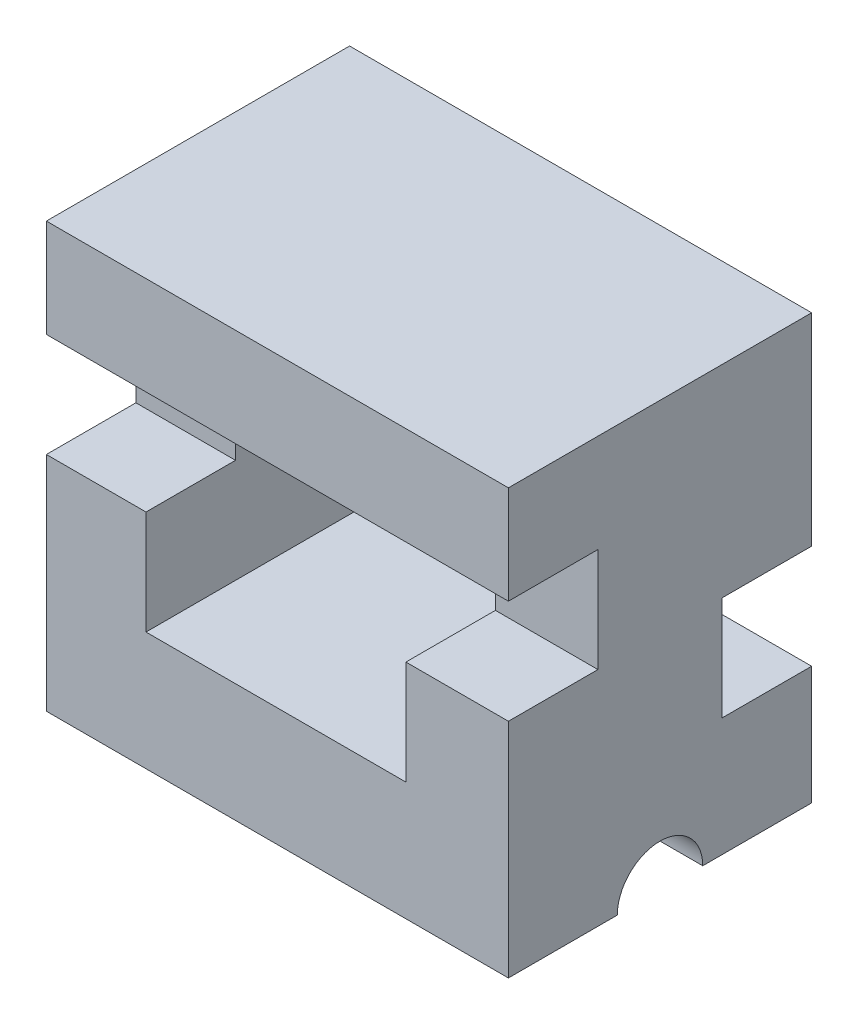
ISO-10303-21;
HEADER;
FILE_DESCRIPTION(('STEP AP214'),'2;1');
FILE_NAME('part.step','',(''),(''),'','','');
FILE_SCHEMA(('AUTOMOTIVE_DESIGN { 1 0 10303 214 1 1 1 1 }'));
ENDSEC;
DATA;
#1=APPLICATION_CONTEXT('core data for automotive mechanical design processes');
#2=APPLICATION_PROTOCOL_DEFINITION('international standard','automotive_design',2000,#1);
#3=PRODUCT_CONTEXT('',#1,'mechanical');
#4=PRODUCT('Part','Part','',(#3));
#5=PRODUCT_RELATED_PRODUCT_CATEGORY('part','',(#4));
#6=PRODUCT_DEFINITION_FORMATION('','',#4);
#7=PRODUCT_DEFINITION_CONTEXT('part definition',#1,'design');
#8=PRODUCT_DEFINITION('design','',#6,#7);
#9=PRODUCT_DEFINITION_SHAPE('','',#8);
#10=(LENGTH_UNIT() NAMED_UNIT(*) SI_UNIT(.MILLI.,.METRE.));
#11=(NAMED_UNIT(*) PLANE_ANGLE_UNIT() SI_UNIT($,.RADIAN.));
#12=(NAMED_UNIT(*) SI_UNIT($,.STERADIAN.) SOLID_ANGLE_UNIT());
#13=UNCERTAINTY_MEASURE_WITH_UNIT(LENGTH_MEASURE(1.E-05),#10,'distance_accuracy_value','');
#14=(GEOMETRIC_REPRESENTATION_CONTEXT(3) GLOBAL_UNCERTAINTY_ASSIGNED_CONTEXT((#13)) GLOBAL_UNIT_ASSIGNED_CONTEXT((#10,
#11,#12)) REPRESENTATION_CONTEXT('',''));
#15=CARTESIAN_POINT('',(0.,0.,0.));
#16=DIRECTION('',(0.,0.,1.));
#17=DIRECTION('',(1.,0.,0.));
#18=AXIS2_PLACEMENT_3D('',#15,#16,#17);
#19=CARTESIAN_POINT('',(0.,37.338,0.));
#20=DIRECTION('',(1.,0.,0.));
#21=DIRECTION('',(0.,0.,-1.));
#22=AXIS2_PLACEMENT_3D('',#19,#20,#21);
#23=PLANE('',#22);
#24=DIRECTION('',(0.,0.,-1.));
#25=VECTOR('',#24,1.);
#26=CARTESIAN_POINT('',(0.,10.414,-49.166422226509));
#27=LINE('',#26,#25);
#28=CARTESIAN_POINT('',(0.,10.414,-18.796));
#29=VERTEX_POINT('',#28);
#30=CARTESIAN_POINT('',(0.,10.414,-26.67));
#31=VERTEX_POINT('',#30);
#32=EDGE_CURVE('E212',#29,#31,#27,.T.);
#33=ORIENTED_EDGE('',*,*,#32,.T.);
#34=DIRECTION('',(0.,-1.,0.));
#35=VECTOR('',#34,1.);
#36=CARTESIAN_POINT('',(0.,37.338,-26.67));
#37=LINE('',#36,#35);
#38=CARTESIAN_POINT('',(0.,0.,-26.67));
#39=VERTEX_POINT('',#38);
#40=EDGE_CURVE('E304',#31,#39,#37,.T.);
#41=ORIENTED_EDGE('',*,*,#40,.T.);
#42=DIRECTION('',(0.,0.,1.));
#43=VECTOR('',#42,1.);
#44=CARTESIAN_POINT('',(0.,0.,0.));
#45=LINE('',#44,#43);
#46=CARTESIAN_POINT('',(0.,0.,-17.0942));
#47=VERTEX_POINT('',#46);
#48=EDGE_CURVE('E305',#39,#47,#45,.T.);
#49=ORIENTED_EDGE('',*,*,#48,.T.);
#50=CARTESIAN_POINT('',(0.,0.,-13.335));
#51=DIRECTION('',(1.,0.,0.));
#52=DIRECTION('',(0.,0.,-1.));
#53=AXIS2_PLACEMENT_3D('',#50,#51,#52);
#54=CIRCLE('',#53,3.7592);
#55=CARTESIAN_POINT('',(0.,0.,-9.57579999999998));
#56=VERTEX_POINT('',#55);
#57=EDGE_CURVE('E289',#47,#56,#54,.T.);
#58=ORIENTED_EDGE('',*,*,#57,.T.);
#59=CARTESIAN_POINT('',(0.,0.,0.));
#60=VERTEX_POINT('',#59);
#61=EDGE_CURVE('E292',#56,#60,#45,.T.);
#62=ORIENTED_EDGE('',*,*,#61,.T.);
#63=DIRECTION('',(0.,-1.,0.));
#64=VECTOR('',#63,1.);
#65=CARTESIAN_POINT('',(0.,37.338,0.));
#66=LINE('',#65,#64);
#67=CARTESIAN_POINT('',(0.,19.558,0.));
#68=VERTEX_POINT('',#67);
#69=EDGE_CURVE('E327',#68,#60,#66,.T.);
#70=ORIENTED_EDGE('',*,*,#69,.F.);
#71=DIRECTION('',(0.,0.,1.));
#72=VECTOR('',#71,1.);
#73=CARTESIAN_POINT('',(0.,19.558,-49.166422226509));
#74=LINE('',#73,#72);
#75=CARTESIAN_POINT('',(0.,19.558,-7.87400000000002));
#76=VERTEX_POINT('',#75);
#77=EDGE_CURVE('E229',#76,#68,#74,.T.);
#78=ORIENTED_EDGE('',*,*,#77,.F.);
#79=DIRECTION('',(0.,1.,0.));
#80=VECTOR('',#79,1.);
#81=CARTESIAN_POINT('',(0.,18.669,-7.874));
#82=LINE('',#81,#80);
#83=CARTESIAN_POINT('',(0.,28.702,-7.87400000000002));
#84=VERTEX_POINT('',#83);
#85=EDGE_CURVE('E231',#76,#84,#82,.T.);
#86=ORIENTED_EDGE('',*,*,#85,.T.);
#87=DIRECTION('',(0.,0.,-1.));
#88=VECTOR('',#87,1.);
#89=CARTESIAN_POINT('',(0.,28.702,-49.166422226509));
#90=LINE('',#89,#88);
#91=CARTESIAN_POINT('',(0.,28.702,0.));
#92=VERTEX_POINT('',#91);
#93=EDGE_CURVE('E235',#92,#84,#90,.T.);
#94=ORIENTED_EDGE('',*,*,#93,.F.);
#95=CARTESIAN_POINT('',(0.,37.338,0.));
#96=VERTEX_POINT('',#95);
#97=EDGE_CURVE('E328',#96,#92,#66,.T.);
#98=ORIENTED_EDGE('',*,*,#97,.F.);
#99=DIRECTION('',(0.,0.,1.));
#100=VECTOR('',#99,1.);
#101=CARTESIAN_POINT('',(0.,37.338,0.));
#102=LINE('',#101,#100);
#103=CARTESIAN_POINT('',(0.,37.338,-26.67));
#104=VERTEX_POINT('',#103);
#105=EDGE_CURVE('E294',#104,#96,#102,.T.);
#106=ORIENTED_EDGE('',*,*,#105,.F.);
#107=CARTESIAN_POINT('',(0.,19.558,-26.67));
#108=VERTEX_POINT('',#107);
#109=EDGE_CURVE('E317',#104,#108,#37,.T.);
#110=ORIENTED_EDGE('',*,*,#109,.T.);
#111=DIRECTION('',(0.,0.,-1.));
#112=VECTOR('',#111,1.);
#113=CARTESIAN_POINT('',(0.,19.558,-49.166422226509));
#114=LINE('',#113,#112);
#115=CARTESIAN_POINT('',(0.,19.558,-18.796));
#116=VERTEX_POINT('',#115);
#117=EDGE_CURVE('E46',#116,#108,#114,.T.);
#118=ORIENTED_EDGE('',*,*,#117,.F.);
#119=DIRECTION('',(0.,-1.,0.));
#120=VECTOR('',#119,1.);
#121=CARTESIAN_POINT('',(0.,18.669,-18.796));
#122=LINE('',#121,#120);
#123=EDGE_CURVE('E222',#116,#29,#122,.T.);
#124=ORIENTED_EDGE('',*,*,#123,.T.);
#125=EDGE_LOOP('',(#33,#41,#49,#58,#62,#70,#78,#86,#94,#98,#106,#110,#118,#124));
#126=FACE_BOUND('',#125,.T.);
#127=ADVANCED_FACE('F32',(#126),#23,.F.);
#128=CARTESIAN_POINT('',(40.64,37.338,0.));
#129=DIRECTION('',(-1.,0.,0.));
#130=DIRECTION('',(0.,0.,1.));
#131=AXIS2_PLACEMENT_3D('',#128,#129,#130);
#132=PLANE('',#131);
#133=DIRECTION('',(0.,0.,1.));
#134=VECTOR('',#133,1.);
#135=CARTESIAN_POINT('',(40.64,10.414,-49.1664222265091));
#136=LINE('',#135,#134);
#137=CARTESIAN_POINT('',(40.64,10.414,-26.67));
#138=VERTEX_POINT('',#137);
#139=CARTESIAN_POINT('',(40.64,10.414,-18.796));
#140=VERTEX_POINT('',#139);
#141=EDGE_CURVE('E185',#138,#140,#136,.T.);
#142=ORIENTED_EDGE('',*,*,#141,.T.);
#143=DIRECTION('',(0.,1.,0.));
#144=VECTOR('',#143,1.);
#145=CARTESIAN_POINT('',(40.64,18.669,-18.796));
#146=LINE('',#145,#144);
#147=CARTESIAN_POINT('',(40.64,19.558,-18.796));
#148=VERTEX_POINT('',#147);
#149=EDGE_CURVE('E195',#140,#148,#146,.T.);
#150=ORIENTED_EDGE('',*,*,#149,.T.);
#151=DIRECTION('',(0.,0.,1.));
#152=VECTOR('',#151,1.);
#153=CARTESIAN_POINT('',(40.64,19.558,-49.1664222265091));
#154=LINE('',#153,#152);
#155=CARTESIAN_POINT('',(40.64,19.558,-26.67));
#156=VERTEX_POINT('',#155);
#157=EDGE_CURVE('E192',#156,#148,#154,.T.);
#158=ORIENTED_EDGE('',*,*,#157,.F.);
#159=DIRECTION('',(0.,-1.,0.));
#160=VECTOR('',#159,1.);
#161=CARTESIAN_POINT('',(40.64,37.338,-26.67));
#162=LINE('',#161,#160);
#163=CARTESIAN_POINT('',(40.64,37.338,-26.67));
#164=VERTEX_POINT('',#163);
#165=EDGE_CURVE('E320',#164,#156,#162,.T.);
#166=ORIENTED_EDGE('',*,*,#165,.F.);
#167=DIRECTION('',(0.,0.,-1.));
#168=VECTOR('',#167,1.);
#169=CARTESIAN_POINT('',(40.64,37.338,0.));
#170=LINE('',#169,#168);
#171=CARTESIAN_POINT('',(40.64,37.338,0.));
#172=VERTEX_POINT('',#171);
#173=EDGE_CURVE('E300',#172,#164,#170,.T.);
#174=ORIENTED_EDGE('',*,*,#173,.F.);
#175=DIRECTION('',(0.,-1.,0.));
#176=VECTOR('',#175,1.);
#177=CARTESIAN_POINT('',(40.64,37.338,0.));
#178=LINE('',#177,#176);
#179=CARTESIAN_POINT('',(40.64,28.702,0.));
#180=VERTEX_POINT('',#179);
#181=EDGE_CURVE('E324',#172,#180,#178,.T.);
#182=ORIENTED_EDGE('',*,*,#181,.T.);
#183=DIRECTION('',(0.,0.,1.));
#184=VECTOR('',#183,1.);
#185=CARTESIAN_POINT('',(40.64,28.702,-49.1664222265091));
#186=LINE('',#185,#184);
#187=CARTESIAN_POINT('',(40.64,28.702,-7.87400000000002));
#188=VERTEX_POINT('',#187);
#189=EDGE_CURVE('E238',#188,#180,#186,.T.);
#190=ORIENTED_EDGE('',*,*,#189,.F.);
#191=DIRECTION('',(0.,-1.,0.));
#192=VECTOR('',#191,1.);
#193=CARTESIAN_POINT('',(40.64,18.669,-7.87400000000002));
#194=LINE('',#193,#192);
#195=CARTESIAN_POINT('',(40.64,19.558,-7.87400000000002));
#196=VERTEX_POINT('',#195);
#197=EDGE_CURVE('E228',#188,#196,#194,.T.);
#198=ORIENTED_EDGE('',*,*,#197,.T.);
#199=DIRECTION('',(0.,0.,-1.));
#200=VECTOR('',#199,1.);
#201=CARTESIAN_POINT('',(40.64,19.558,-49.1664222265091));
#202=LINE('',#201,#200);
#203=CARTESIAN_POINT('',(40.64,19.558,0.));
#204=VERTEX_POINT('',#203);
#205=EDGE_CURVE('E241',#204,#196,#202,.T.);
#206=ORIENTED_EDGE('',*,*,#205,.F.);
#207=CARTESIAN_POINT('',(40.64,0.,0.));
#208=VERTEX_POINT('',#207);
#209=EDGE_CURVE('E323',#204,#208,#178,.T.);
#210=ORIENTED_EDGE('',*,*,#209,.T.);
#211=DIRECTION('',(0.,0.,-1.));
#212=VECTOR('',#211,1.);
#213=CARTESIAN_POINT('',(40.64,0.,0.));
#214=LINE('',#213,#212);
#215=CARTESIAN_POINT('',(40.64,0.,-9.5758));
#216=VERTEX_POINT('',#215);
#217=EDGE_CURVE('E312',#208,#216,#214,.T.);
#218=ORIENTED_EDGE('',*,*,#217,.T.);
#219=CARTESIAN_POINT('',(40.64,0.,-13.335));
#220=DIRECTION('',(1.,0.,0.));
#221=DIRECTION('',(0.,0.,-1.));
#222=AXIS2_PLACEMENT_3D('',#219,#220,#221);
#223=CIRCLE('',#222,3.7592);
#224=CARTESIAN_POINT('',(40.64,0.,-17.0942));
#225=VERTEX_POINT('',#224);
#226=EDGE_CURVE('E288',#225,#216,#223,.T.);
#227=ORIENTED_EDGE('',*,*,#226,.F.);
#228=CARTESIAN_POINT('',(40.64,0.,-26.67));
#229=VERTEX_POINT('',#228);
#230=EDGE_CURVE('E311',#225,#229,#214,.T.);
#231=ORIENTED_EDGE('',*,*,#230,.T.);
#232=EDGE_CURVE('E204',#138,#229,#162,.T.);
#233=ORIENTED_EDGE('',*,*,#232,.F.);
#234=EDGE_LOOP('',(#142,#150,#158,#166,#174,#182,#190,#198,#206,#210,#218,#227,#231,#233));
#235=FACE_BOUND('',#234,.T.);
#236=ADVANCED_FACE('F202',(#235),#132,.F.);
#237=CARTESIAN_POINT('',(0.,37.338,-26.67));
#238=DIRECTION('',(0.,0.,1.));
#239=DIRECTION('',(1.,0.,0.));
#240=AXIS2_PLACEMENT_3D('',#237,#238,#239);
#241=PLANE('',#240);
#242=DIRECTION('',(-1.,0.,0.));
#243=VECTOR('',#242,1.);
#244=CARTESIAN_POINT('',(8.76299999999999,10.414,-26.67));
#245=LINE('',#244,#243);
#246=EDGE_CURVE('E269',#138,#31,#245,.T.);
#247=ORIENTED_EDGE('',*,*,#246,.F.);
#248=ORIENTED_EDGE('',*,*,#232,.T.);
#249=DIRECTION('',(-1.,0.,0.));
#250=VECTOR('',#249,1.);
#251=CARTESIAN_POINT('',(0.,0.,-26.67));
#252=LINE('',#251,#250);
#253=EDGE_CURVE('E298',#229,#39,#252,.T.);
#254=ORIENTED_EDGE('',*,*,#253,.T.);
#255=ORIENTED_EDGE('',*,*,#40,.F.);
#256=EDGE_LOOP('',(#247,#248,#254,#255));
#257=FACE_BOUND('',#256,.T.);
#258=ADVANCED_FACE('F401',(#257),#241,.F.);
#259=CARTESIAN_POINT('',(0.,37.338,0.));
#260=DIRECTION('',(0.,0.,-1.));
#261=DIRECTION('',(-1.,0.,0.));
#262=AXIS2_PLACEMENT_3D('',#259,#260,#261);
#263=PLANE('',#262);
#264=ORIENTED_EDGE('',*,*,#209,.F.);
#265=DIRECTION('',(1.,0.,0.));
#266=VECTOR('',#265,1.);
#267=CARTESIAN_POINT('',(-12.0670050965432,19.558,0.));
#268=LINE('',#267,#266);
#269=CARTESIAN_POINT('',(31.623,19.558,0.));
#270=VERTEX_POINT('',#269);
#271=EDGE_CURVE('E250',#270,#204,#268,.T.);
#272=ORIENTED_EDGE('',*,*,#271,.F.);
#273=DIRECTION('',(0.,1.,0.));
#274=VECTOR('',#273,1.);
#275=CARTESIAN_POINT('',(31.623,28.702,0.));
#276=LINE('',#275,#274);
#277=CARTESIAN_POINT('',(31.623,10.414,0.));
#278=VERTEX_POINT('',#277);
#279=EDGE_CURVE('E274',#278,#270,#276,.T.);
#280=ORIENTED_EDGE('',*,*,#279,.F.);
#281=DIRECTION('',(1.,0.,0.));
#282=VECTOR('',#281,1.);
#283=CARTESIAN_POINT('',(8.76299999999999,10.414,0.));
#284=LINE('',#283,#282);
#285=CARTESIAN_POINT('',(8.76299999999999,10.414,0.));
#286=VERTEX_POINT('',#285);
#287=EDGE_CURVE('E272',#286,#278,#284,.T.);
#288=ORIENTED_EDGE('',*,*,#287,.F.);
#289=DIRECTION('',(0.,-1.,0.));
#290=VECTOR('',#289,1.);
#291=CARTESIAN_POINT('',(8.76299999999999,28.702,0.));
#292=LINE('',#291,#290);
#293=CARTESIAN_POINT('',(8.76299999999999,19.558,0.));
#294=VERTEX_POINT('',#293);
#295=EDGE_CURVE('E260',#294,#286,#292,.T.);
#296=ORIENTED_EDGE('',*,*,#295,.F.);
#297=EDGE_CURVE('E248',#68,#294,#268,.T.);
#298=ORIENTED_EDGE('',*,*,#297,.F.);
#299=ORIENTED_EDGE('',*,*,#69,.T.);
#300=DIRECTION('',(1.,0.,0.));
#301=VECTOR('',#300,1.);
#302=CARTESIAN_POINT('',(0.,0.,0.));
#303=LINE('',#302,#301);
#304=EDGE_CURVE('E308',#60,#208,#303,.T.);
#305=ORIENTED_EDGE('',*,*,#304,.T.);
#306=EDGE_LOOP('',(#264,#272,#280,#288,#296,#298,#299,#305));
#307=FACE_BOUND('',#306,.T.);
#308=ADVANCED_FACE('F347',(#307),#263,.F.);
#309=CARTESIAN_POINT('',(8.76299999999999,28.702,-55.945084013543));
#310=DIRECTION('',(-1.,0.,0.));
#311=DIRECTION('',(0.,-1.,0.));
#312=AXIS2_PLACEMENT_3D('',#309,#310,#311);
#313=PLANE('',#312);
#314=DIRECTION('',(0.,-1.,0.));
#315=VECTOR('',#314,1.);
#316=CARTESIAN_POINT('',(8.76299999999999,28.702,-18.796));
#317=LINE('',#316,#315);
#318=CARTESIAN_POINT('',(8.76299999999999,19.558,-18.796));
#319=VERTEX_POINT('',#318);
#320=CARTESIAN_POINT('',(8.76299999999999,10.414,-18.796));
#321=VERTEX_POINT('',#320);
#322=EDGE_CURVE('E221',#319,#321,#317,.T.);
#323=ORIENTED_EDGE('',*,*,#322,.F.);
#324=DIRECTION('',(0.,0.,-1.));
#325=VECTOR('',#324,1.);
#326=CARTESIAN_POINT('',(8.76299999999999,19.558,-55.945084013543));
#327=LINE('',#326,#325);
#328=CARTESIAN_POINT('',(8.76299999999999,19.558,-26.67));
#329=VERTEX_POINT('',#328);
#330=EDGE_CURVE('E225',#319,#329,#327,.T.);
#331=ORIENTED_EDGE('',*,*,#330,.T.);
#332=DIRECTION('',(0.,1.,0.));
#333=VECTOR('',#332,1.);
#334=CARTESIAN_POINT('',(8.76299999999999,28.702,-26.67));
#335=LINE('',#334,#333);
#336=CARTESIAN_POINT('',(8.76299999999999,28.702,-26.67));
#337=VERTEX_POINT('',#336);
#338=EDGE_CURVE('E267',#329,#337,#335,.T.);
#339=ORIENTED_EDGE('',*,*,#338,.T.);
#340=DIRECTION('',(0.,0.,1.));
#341=VECTOR('',#340,1.);
#342=CARTESIAN_POINT('',(8.76299999999999,28.702,-55.945084013543));
#343=LINE('',#342,#341);
#344=CARTESIAN_POINT('',(8.76299999999999,28.702,-7.87400000000001));
#345=VERTEX_POINT('',#344);
#346=EDGE_CURVE('E265',#337,#345,#343,.T.);
#347=ORIENTED_EDGE('',*,*,#346,.T.);
#348=DIRECTION('',(0.,1.,0.));
#349=VECTOR('',#348,1.);
#350=CARTESIAN_POINT('',(8.76299999999999,28.702,-7.874));
#351=LINE('',#350,#349);
#352=CARTESIAN_POINT('',(8.76299999999999,19.558,-7.874));
#353=VERTEX_POINT('',#352);
#354=EDGE_CURVE('E257',#353,#345,#351,.T.);
#355=ORIENTED_EDGE('',*,*,#354,.F.);
#356=DIRECTION('',(0.,0.,1.));
#357=VECTOR('',#356,1.);
#358=CARTESIAN_POINT('',(8.76299999999999,19.558,-55.945084013543));
#359=LINE('',#358,#357);
#360=EDGE_CURVE('E254',#353,#294,#359,.T.);
#361=ORIENTED_EDGE('',*,*,#360,.T.);
#362=ORIENTED_EDGE('',*,*,#295,.T.);
#363=DIRECTION('',(0.,0.,1.));
#364=VECTOR('',#363,1.);
#365=CARTESIAN_POINT('',(8.76299999999999,10.414,-55.945084013543));
#366=LINE('',#365,#364);
#367=EDGE_CURVE('E279',#321,#286,#366,.T.);
#368=ORIENTED_EDGE('',*,*,#367,.F.);
#369=EDGE_LOOP('',(#323,#331,#339,#347,#355,#361,#362,#368));
#370=FACE_BOUND('',#369,.T.);
#371=ADVANCED_FACE('F391',(#370),#313,.F.);
#372=CARTESIAN_POINT('',(31.623,28.702,-55.945084013543));
#373=DIRECTION('',(1.,0.,0.));
#374=DIRECTION('',(0.,1.,0.));
#375=AXIS2_PLACEMENT_3D('',#372,#373,#374);
#376=PLANE('',#375);
#377=DIRECTION('',(0.,-1.,0.));
#378=VECTOR('',#377,1.);
#379=CARTESIAN_POINT('',(31.623,28.702,-26.67));
#380=LINE('',#379,#378);
#381=CARTESIAN_POINT('',(31.623,28.702,-26.67));
#382=VERTEX_POINT('',#381);
#383=CARTESIAN_POINT('',(31.623,19.558,-26.67));
#384=VERTEX_POINT('',#383);
#385=EDGE_CURVE('E261',#382,#384,#380,.T.);
#386=ORIENTED_EDGE('',*,*,#385,.T.);
#387=DIRECTION('',(0.,0.,1.));
#388=VECTOR('',#387,1.);
#389=CARTESIAN_POINT('',(31.623,19.558,-55.945084013543));
#390=LINE('',#389,#388);
#391=CARTESIAN_POINT('',(31.623,19.558,-18.796));
#392=VERTEX_POINT('',#391);
#393=EDGE_CURVE('E54',#384,#392,#390,.T.);
#394=ORIENTED_EDGE('',*,*,#393,.T.);
#395=DIRECTION('',(0.,1.,0.));
#396=VECTOR('',#395,1.);
#397=CARTESIAN_POINT('',(31.623,28.702,-18.796));
#398=LINE('',#397,#396);
#399=CARTESIAN_POINT('',(31.623,10.414,-18.796));
#400=VERTEX_POINT('',#399);
#401=EDGE_CURVE('E219',#400,#392,#398,.T.);
#402=ORIENTED_EDGE('',*,*,#401,.F.);
#403=DIRECTION('',(0.,0.,1.));
#404=VECTOR('',#403,1.);
#405=CARTESIAN_POINT('',(31.623,10.414,-55.945084013543));
#406=LINE('',#405,#404);
#407=EDGE_CURVE('E188',#400,#278,#406,.T.);
#408=ORIENTED_EDGE('',*,*,#407,.T.);
#409=ORIENTED_EDGE('',*,*,#279,.T.);
#410=DIRECTION('',(0.,0.,-1.));
#411=VECTOR('',#410,1.);
#412=CARTESIAN_POINT('',(31.623,19.558,-55.945084013543));
#413=LINE('',#412,#411);
#414=CARTESIAN_POINT('',(31.623,19.558,-7.87400000000001));
#415=VERTEX_POINT('',#414);
#416=EDGE_CURVE('E39',#270,#415,#413,.T.);
#417=ORIENTED_EDGE('',*,*,#416,.T.);
#418=DIRECTION('',(0.,-1.,0.));
#419=VECTOR('',#418,1.);
#420=CARTESIAN_POINT('',(31.623,28.702,-7.87400000000001));
#421=LINE('',#420,#419);
#422=CARTESIAN_POINT('',(31.623,28.702,-7.87400000000001));
#423=VERTEX_POINT('',#422);
#424=EDGE_CURVE('E11',#423,#415,#421,.T.);
#425=ORIENTED_EDGE('',*,*,#424,.F.);
#426=DIRECTION('',(0.,0.,1.));
#427=VECTOR('',#426,1.);
#428=CARTESIAN_POINT('',(31.623,28.702,-55.945084013543));
#429=LINE('',#428,#427);
#430=EDGE_CURVE('E282',#382,#423,#429,.T.);
#431=ORIENTED_EDGE('',*,*,#430,.F.);
#432=EDGE_LOOP('',(#386,#394,#402,#408,#409,#417,#425,#431));
#433=FACE_BOUND('',#432,.T.);
#434=ADVANCED_FACE('F337',(#433),#376,.F.);
#435=CARTESIAN_POINT('',(0.,0.,-26.67));
#436=DIRECTION('',(0.,-1.,0.));
#437=DIRECTION('',(0.,0.,-1.));
#438=AXIS2_PLACEMENT_3D('',#435,#436,#437);
#439=PLANE('',#438);
#440=DIRECTION('',(1.,0.,0.));
#441=VECTOR('',#440,1.);
#442=CARTESIAN_POINT('',(0.,0.,-17.0942));
#443=LINE('',#442,#441);
#444=EDGE_CURVE('E333',#47,#225,#443,.T.);
#445=ORIENTED_EDGE('',*,*,#444,.F.);
#446=ORIENTED_EDGE('',*,*,#48,.F.);
#447=ORIENTED_EDGE('',*,*,#253,.F.);
#448=ORIENTED_EDGE('',*,*,#230,.F.);
#449=EDGE_LOOP('',(#445,#446,#447,#448));
#450=FACE_BOUND('',#449,.T.);
#451=ADVANCED_FACE('F407',(#450),#439,.T.);
#452=ORIENTED_EDGE('',*,*,#97,.T.);
#453=DIRECTION('',(-1.,0.,0.));
#454=VECTOR('',#453,1.);
#455=CARTESIAN_POINT('',(8.76299999999999,28.702,0.));
#456=LINE('',#455,#454);
#457=EDGE_CURVE('E277',#180,#92,#456,.T.);
#458=ORIENTED_EDGE('',*,*,#457,.F.);
#459=ORIENTED_EDGE('',*,*,#181,.F.);
#460=DIRECTION('',(1.,0.,0.));
#461=VECTOR('',#460,1.);
#462=CARTESIAN_POINT('',(0.,37.338,0.));
#463=LINE('',#462,#461);
#464=EDGE_CURVE('E297',#96,#172,#463,.T.);
#465=ORIENTED_EDGE('',*,*,#464,.F.);
#466=EDGE_LOOP('',(#452,#458,#459,#465));
#467=FACE_BOUND('',#466,.T.);
#468=ADVANCED_FACE('F375',(#467),#263,.F.);
#469=ORIENTED_EDGE('',*,*,#165,.T.);
#470=DIRECTION('',(1.,0.,0.));
#471=VECTOR('',#470,1.);
#472=CARTESIAN_POINT('',(-12.0670050965433,19.558,-26.67));
#473=LINE('',#472,#471);
#474=EDGE_CURVE('E214',#384,#156,#473,.T.);
#475=ORIENTED_EDGE('',*,*,#474,.F.);
#476=ORIENTED_EDGE('',*,*,#385,.F.);
#477=DIRECTION('',(1.,0.,0.));
#478=VECTOR('',#477,1.);
#479=CARTESIAN_POINT('',(8.76299999999999,28.702,-26.67));
#480=LINE('',#479,#478);
#481=EDGE_CURVE('E264',#337,#382,#480,.T.);
#482=ORIENTED_EDGE('',*,*,#481,.F.);
#483=ORIENTED_EDGE('',*,*,#338,.F.);
#484=EDGE_CURVE('E213',#108,#329,#473,.T.);
#485=ORIENTED_EDGE('',*,*,#484,.F.);
#486=ORIENTED_EDGE('',*,*,#109,.F.);
#487=DIRECTION('',(-1.,0.,0.));
#488=VECTOR('',#487,1.);
#489=CARTESIAN_POINT('',(0.,37.338,-26.67));
#490=LINE('',#489,#488);
#491=EDGE_CURVE('E302',#164,#104,#490,.T.);
#492=ORIENTED_EDGE('',*,*,#491,.F.);
#493=EDGE_LOOP('',(#469,#475,#476,#482,#483,#485,#486,#492));
#494=FACE_BOUND('',#493,.T.);
#495=ADVANCED_FACE('F362',(#494),#241,.F.);
#496=CARTESIAN_POINT('',(0.,37.338,-26.67));
#497=DIRECTION('',(0.,-1.,0.));
#498=DIRECTION('',(0.,0.,-1.));
#499=AXIS2_PLACEMENT_3D('',#496,#497,#498);
#500=PLANE('',#499);
#501=ORIENTED_EDGE('',*,*,#105,.T.);
#502=ORIENTED_EDGE('',*,*,#464,.T.);
#503=ORIENTED_EDGE('',*,*,#173,.T.);
#504=ORIENTED_EDGE('',*,*,#491,.T.);
#505=EDGE_LOOP('',(#501,#502,#503,#504));
#506=FACE_BOUND('',#505,.T.);
#507=ADVANCED_FACE('F371',(#506),#500,.F.);
#508=DIRECTION('',(1.,0.,0.));
#509=VECTOR('',#508,1.);
#510=CARTESIAN_POINT('',(0.,0.,-9.57579999999998));
#511=LINE('',#510,#509);
#512=EDGE_CURVE('E331',#216,#56,#511,.F.);
#513=ORIENTED_EDGE('',*,*,#512,.F.);
#514=ORIENTED_EDGE('',*,*,#217,.F.);
#515=ORIENTED_EDGE('',*,*,#304,.F.);
#516=ORIENTED_EDGE('',*,*,#61,.F.);
#517=EDGE_LOOP('',(#513,#514,#515,#516));
#518=FACE_BOUND('',#517,.T.);
#519=ADVANCED_FACE('F413',(#518),#439,.T.);
#520=CARTESIAN_POINT('',(0.,0.,-13.335));
#521=DIRECTION('',(1.,0.,0.));
#522=DIRECTION('',(0.,0.,-1.));
#523=AXIS2_PLACEMENT_3D('',#520,#521,#522);
#524=CYLINDRICAL_SURFACE('',#523,3.7592);
#525=ORIENTED_EDGE('',*,*,#444,.T.);
#526=ORIENTED_EDGE('',*,*,#226,.T.);
#527=ORIENTED_EDGE('',*,*,#512,.T.);
#528=ORIENTED_EDGE('',*,*,#57,.F.);
#529=EDGE_LOOP('',(#525,#526,#527,#528));
#530=FACE_BOUND('',#529,.T.);
#531=ADVANCED_FACE('F414',(#530),#524,.F.);
#532=CARTESIAN_POINT('',(8.76299999999999,28.702,-55.945084013543));
#533=DIRECTION('',(0.,1.,0.));
#534=DIRECTION('',(0.,0.,1.));
#535=AXIS2_PLACEMENT_3D('',#532,#533,#534);
#536=PLANE('',#535);
#537=ORIENTED_EDGE('',*,*,#457,.T.);
#538=ORIENTED_EDGE('',*,*,#93,.T.);
#539=DIRECTION('',(1.,0.,0.));
#540=VECTOR('',#539,1.);
#541=CARTESIAN_POINT('',(-12.0670050965432,28.702,-7.87399999999999));
#542=LINE('',#541,#540);
#543=EDGE_CURVE('E251',#84,#345,#542,.T.);
#544=ORIENTED_EDGE('',*,*,#543,.T.);
#545=ORIENTED_EDGE('',*,*,#346,.F.);
#546=ORIENTED_EDGE('',*,*,#481,.T.);
#547=ORIENTED_EDGE('',*,*,#430,.T.);
#548=EDGE_CURVE('E244',#423,#188,#542,.T.);
#549=ORIENTED_EDGE('',*,*,#548,.T.);
#550=ORIENTED_EDGE('',*,*,#189,.T.);
#551=EDGE_LOOP('',(#537,#538,#544,#545,#546,#547,#549,#550));
#552=FACE_BOUND('',#551,.T.);
#553=ADVANCED_FACE('F357',(#552),#536,.F.);
#554=CARTESIAN_POINT('',(8.76299999999999,10.414,-55.945084013543));
#555=DIRECTION('',(0.,-1.,0.));
#556=DIRECTION('',(0.,0.,-1.));
#557=AXIS2_PLACEMENT_3D('',#554,#555,#556);
#558=PLANE('',#557);
#559=ORIENTED_EDGE('',*,*,#246,.T.);
#560=ORIENTED_EDGE('',*,*,#32,.F.);
#561=DIRECTION('',(1.,0.,0.));
#562=VECTOR('',#561,1.);
#563=CARTESIAN_POINT('',(-12.0670050965432,10.414,-18.796));
#564=LINE('',#563,#562);
#565=EDGE_CURVE('E191',#29,#321,#564,.T.);
#566=ORIENTED_EDGE('',*,*,#565,.T.);
#567=ORIENTED_EDGE('',*,*,#367,.T.);
#568=ORIENTED_EDGE('',*,*,#287,.T.);
#569=ORIENTED_EDGE('',*,*,#407,.F.);
#570=EDGE_CURVE('E181',#400,#140,#564,.T.);
#571=ORIENTED_EDGE('',*,*,#570,.T.);
#572=ORIENTED_EDGE('',*,*,#141,.F.);
#573=EDGE_LOOP('',(#559,#560,#566,#567,#568,#569,#571,#572));
#574=FACE_BOUND('',#573,.T.);
#575=ADVANCED_FACE('F183',(#574),#558,.F.);
#576=CARTESIAN_POINT('',(-12.0670050965433,19.558,-49.166422226509));
#577=DIRECTION('',(0.,-1.,0.));
#578=DIRECTION('',(0.,0.,-1.));
#579=AXIS2_PLACEMENT_3D('',#576,#577,#578);
#580=PLANE('',#579);
#581=ORIENTED_EDGE('',*,*,#271,.T.);
#582=ORIENTED_EDGE('',*,*,#205,.T.);
#583=DIRECTION('',(1.,0.,0.));
#584=VECTOR('',#583,1.);
#585=CARTESIAN_POINT('',(-12.0670050965432,19.558,-7.87399999999999));
#586=LINE('',#585,#584);
#587=EDGE_CURVE('E247',#415,#196,#586,.T.);
#588=ORIENTED_EDGE('',*,*,#587,.F.);
#589=ORIENTED_EDGE('',*,*,#416,.F.);
#590=EDGE_LOOP('',(#581,#582,#588,#589));
#591=FACE_BOUND('',#590,.T.);
#592=ADVANCED_FACE('F343',(#591),#580,.F.);
#593=CARTESIAN_POINT('',(-12.0670050965432,18.669,-7.87399999999999));
#594=DIRECTION('',(0.,0.,1.));
#595=DIRECTION('',(1.,0.,0.));
#596=AXIS2_PLACEMENT_3D('',#593,#594,#595);
#597=PLANE('',#596);
#598=ORIENTED_EDGE('',*,*,#424,.T.);
#599=ORIENTED_EDGE('',*,*,#587,.T.);
#600=ORIENTED_EDGE('',*,*,#197,.F.);
#601=ORIENTED_EDGE('',*,*,#548,.F.);
#602=EDGE_LOOP('',(#598,#599,#600,#601));
#603=FACE_BOUND('',#602,.T.);
#604=ADVANCED_FACE('F355',(#603),#597,.T.);
#605=ORIENTED_EDGE('',*,*,#354,.T.);
#606=ORIENTED_EDGE('',*,*,#543,.F.);
#607=ORIENTED_EDGE('',*,*,#85,.F.);
#608=EDGE_CURVE('E232',#76,#353,#586,.T.);
#609=ORIENTED_EDGE('',*,*,#608,.T.);
#610=EDGE_LOOP('',(#605,#606,#607,#609));
#611=FACE_BOUND('',#610,.T.);
#612=ADVANCED_FACE('F383',(#611),#597,.T.);
#613=ORIENTED_EDGE('',*,*,#608,.F.);
#614=ORIENTED_EDGE('',*,*,#77,.T.);
#615=ORIENTED_EDGE('',*,*,#297,.T.);
#616=ORIENTED_EDGE('',*,*,#360,.F.);
#617=EDGE_LOOP('',(#613,#614,#615,#616));
#618=FACE_BOUND('',#617,.T.);
#619=ADVANCED_FACE('F386',(#618),#580,.F.);
#620=CARTESIAN_POINT('',(-12.0670050965433,19.558,-49.166422226509));
#621=DIRECTION('',(0.,1.,0.));
#622=DIRECTION('',(0.,0.,1.));
#623=AXIS2_PLACEMENT_3D('',#620,#621,#622);
#624=PLANE('',#623);
#625=DIRECTION('',(1.,0.,0.));
#626=VECTOR('',#625,1.);
#627=CARTESIAN_POINT('',(-12.0670050965432,19.558,-18.796));
#628=LINE('',#627,#626);
#629=EDGE_CURVE('E209',#116,#319,#628,.T.);
#630=ORIENTED_EDGE('',*,*,#629,.F.);
#631=ORIENTED_EDGE('',*,*,#117,.T.);
#632=ORIENTED_EDGE('',*,*,#484,.T.);
#633=ORIENTED_EDGE('',*,*,#330,.F.);
#634=EDGE_LOOP('',(#630,#631,#632,#633));
#635=FACE_BOUND('',#634,.T.);
#636=ADVANCED_FACE('F397',(#635),#624,.F.);
#637=CARTESIAN_POINT('',(-12.0670050965432,18.669,-18.796));
#638=DIRECTION('',(0.,0.,-1.));
#639=DIRECTION('',(-1.,0.,0.));
#640=AXIS2_PLACEMENT_3D('',#637,#638,#639);
#641=PLANE('',#640);
#642=ORIENTED_EDGE('',*,*,#322,.T.);
#643=ORIENTED_EDGE('',*,*,#565,.F.);
#644=ORIENTED_EDGE('',*,*,#123,.F.);
#645=ORIENTED_EDGE('',*,*,#629,.T.);
#646=EDGE_LOOP('',(#642,#643,#644,#645));
#647=FACE_BOUND('',#646,.T.);
#648=ADVANCED_FACE('F395',(#647),#641,.T.);
#649=ORIENTED_EDGE('',*,*,#474,.T.);
#650=ORIENTED_EDGE('',*,*,#157,.T.);
#651=EDGE_CURVE('E197',#392,#148,#628,.T.);
#652=ORIENTED_EDGE('',*,*,#651,.F.);
#653=ORIENTED_EDGE('',*,*,#393,.F.);
#654=EDGE_LOOP('',(#649,#650,#652,#653));
#655=FACE_BOUND('',#654,.T.);
#656=ADVANCED_FACE('F366',(#655),#624,.F.);
#657=ORIENTED_EDGE('',*,*,#401,.T.);
#658=ORIENTED_EDGE('',*,*,#651,.T.);
#659=ORIENTED_EDGE('',*,*,#149,.F.);
#660=ORIENTED_EDGE('',*,*,#570,.F.);
#661=EDGE_LOOP('',(#657,#658,#659,#660));
#662=FACE_BOUND('',#661,.T.);
#663=ADVANCED_FACE('F196',(#662),#641,.T.);
#664=CLOSED_SHELL('',(#127,#236,#258,#308,#371,#434,#451,#468,#495,#507,#519,#531,#553,#575,
#592,#604,#612,#619,#636,#648,#656,#663));
#665=MANIFOLD_SOLID_BREP('B2',#664);
#666=ADVANCED_BREP_SHAPE_REPRESENTATION('',(#18,#665),#14);
#667=SHAPE_DEFINITION_REPRESENTATION(#9,#666);
ENDSEC;
END-ISO-10303-21;
